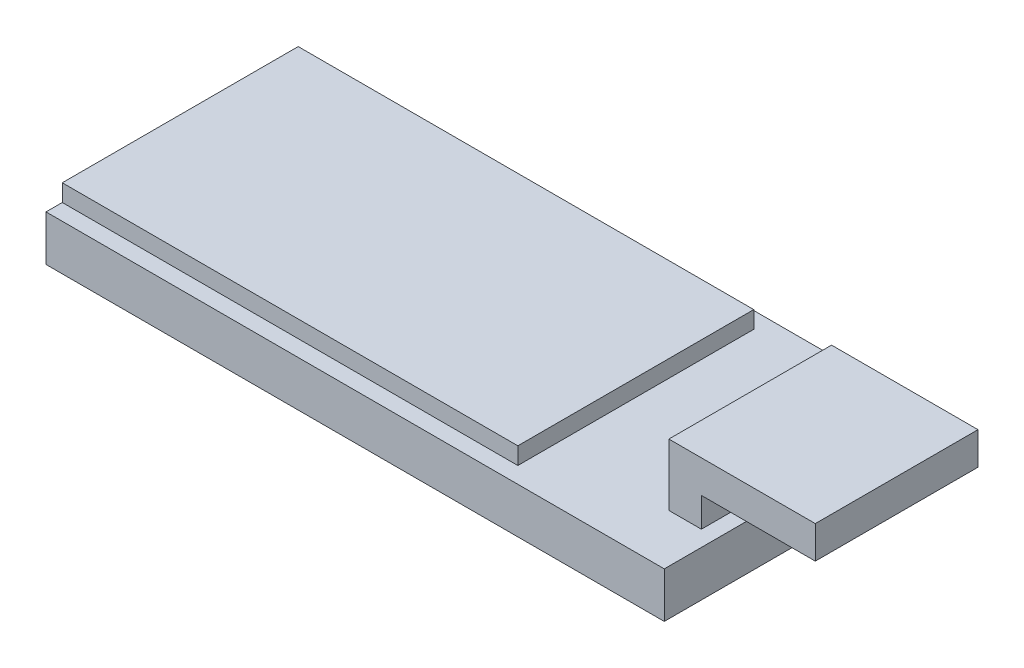
ISO-10303-21;
HEADER;
FILE_DESCRIPTION(('STEP AP214'),'2;1');
FILE_NAME('part.step','',(''),(''),'','','');
FILE_SCHEMA(('AUTOMOTIVE_DESIGN { 1 0 10303 214 1 1 1 1 }'));
ENDSEC;
DATA;
#1=APPLICATION_CONTEXT('core data for automotive mechanical design processes');
#2=APPLICATION_PROTOCOL_DEFINITION('international standard','automotive_design',2000,#1);
#3=PRODUCT_CONTEXT('',#1,'mechanical');
#4=PRODUCT('Part','Part','',(#3));
#5=PRODUCT_RELATED_PRODUCT_CATEGORY('part','',(#4));
#6=PRODUCT_DEFINITION_FORMATION('','',#4);
#7=PRODUCT_DEFINITION_CONTEXT('part definition',#1,'design');
#8=PRODUCT_DEFINITION('design','',#6,#7);
#9=PRODUCT_DEFINITION_SHAPE('','',#8);
#10=(LENGTH_UNIT() NAMED_UNIT(*) SI_UNIT(.MILLI.,.METRE.));
#11=(NAMED_UNIT(*) PLANE_ANGLE_UNIT() SI_UNIT($,.RADIAN.));
#12=(NAMED_UNIT(*) SI_UNIT($,.STERADIAN.) SOLID_ANGLE_UNIT());
#13=UNCERTAINTY_MEASURE_WITH_UNIT(LENGTH_MEASURE(1.E-05),#10,'distance_accuracy_value','');
#14=(GEOMETRIC_REPRESENTATION_CONTEXT(3) GLOBAL_UNCERTAINTY_ASSIGNED_CONTEXT((#13)) GLOBAL_UNIT_ASSIGNED_CONTEXT((#10,
#11,#12)) REPRESENTATION_CONTEXT('',''));
#15=CARTESIAN_POINT('',(0.,0.,0.));
#16=DIRECTION('',(0.,0.,1.));
#17=DIRECTION('',(1.,0.,0.));
#18=AXIS2_PLACEMENT_3D('',#15,#16,#17);
#19=CARTESIAN_POINT('',(0.,-0.4,0.));
#20=DIRECTION('',(0.,1.,0.));
#21=DIRECTION('',(0.,0.,1.));
#22=AXIS2_PLACEMENT_3D('',#19,#20,#21);
#23=PLANE('',#22);
#24=DIRECTION('',(1.,0.,0.));
#25=VECTOR('',#24,1.);
#26=CARTESIAN_POINT('',(0.,-0.4,-8.25));
#27=LINE('',#26,#25);
#28=CARTESIAN_POINT('',(0.,-0.4,-8.25));
#29=VERTEX_POINT('',#28);
#30=CARTESIAN_POINT('',(38.,-0.4,-8.25));
#31=VERTEX_POINT('',#30);
#32=EDGE_CURVE('E243',#29,#31,#27,.T.);
#33=ORIENTED_EDGE('',*,*,#32,.T.);
#34=DIRECTION('',(0.,0.,1.));
#35=VECTOR('',#34,1.);
#36=CARTESIAN_POINT('',(38.,-0.4,0.));
#37=LINE('',#36,#35);
#38=CARTESIAN_POINT('',(38.,-0.4,8.24999999999998));
#39=VERTEX_POINT('',#38);
#40=EDGE_CURVE('E252',#31,#39,#37,.T.);
#41=ORIENTED_EDGE('',*,*,#40,.T.);
#42=DIRECTION('',(1.,0.,0.));
#43=VECTOR('',#42,1.);
#44=CARTESIAN_POINT('',(0.,-0.4,8.25));
#45=LINE('',#44,#43);
#46=CARTESIAN_POINT('',(0.,-0.4,8.25));
#47=VERTEX_POINT('',#46);
#48=EDGE_CURVE('E249',#47,#39,#45,.T.);
#49=ORIENTED_EDGE('',*,*,#48,.F.);
#50=DIRECTION('',(0.,0.,1.));
#51=VECTOR('',#50,1.);
#52=CARTESIAN_POINT('',(0.,-0.4,0.));
#53=LINE('',#52,#51);
#54=EDGE_CURVE('E246',#29,#47,#53,.T.);
#55=ORIENTED_EDGE('',*,*,#54,.F.);
#56=EDGE_LOOP('',(#33,#41,#49,#55));
#57=FACE_BOUND('',#56,.T.);
#58=DIRECTION('',(-1.,0.,0.));
#59=VECTOR('',#58,1.);
#60=CARTESIAN_POINT('',(0.,-0.4,5.));
#61=LINE('',#60,#59);
#62=CARTESIAN_POINT('',(37.0320811107328,-0.4,5.));
#63=VERTEX_POINT('',#62);
#64=CARTESIAN_POINT('',(35.0320811107328,-0.4,5.));
#65=VERTEX_POINT('',#64);
#66=EDGE_CURVE('E192',#63,#65,#61,.T.);
#67=ORIENTED_EDGE('',*,*,#66,.F.);
#68=DIRECTION('',(0.,0.,1.));
#69=VECTOR('',#68,1.);
#70=CARTESIAN_POINT('',(37.0320811107328,-0.4,0.));
#71=LINE('',#70,#69);
#72=CARTESIAN_POINT('',(37.0320811107328,-0.4,-5.));
#73=VERTEX_POINT('',#72);
#74=EDGE_CURVE('E201',#73,#63,#71,.T.);
#75=ORIENTED_EDGE('',*,*,#74,.F.);
#76=DIRECTION('',(-1.,0.,0.));
#77=VECTOR('',#76,1.);
#78=CARTESIAN_POINT('',(0.,-0.4,-5.));
#79=LINE('',#78,#77);
#80=CARTESIAN_POINT('',(35.0320811107328,-0.4,-5.));
#81=VERTEX_POINT('',#80);
#82=EDGE_CURVE('E189',#73,#81,#79,.T.);
#83=ORIENTED_EDGE('',*,*,#82,.T.);
#84=DIRECTION('',(0.,0.,-1.));
#85=VECTOR('',#84,1.);
#86=CARTESIAN_POINT('',(35.0320811107328,-0.4,0.));
#87=LINE('',#86,#85);
#88=EDGE_CURVE('E199',#65,#81,#87,.T.);
#89=ORIENTED_EDGE('',*,*,#88,.F.);
#90=EDGE_LOOP('',(#67,#75,#83,#89));
#91=FACE_BOUND('',#90,.T.);
#92=ADVANCED_FACE('F43',(#57,#91),#23,.F.);
#93=CARTESIAN_POINT('',(0.,2.4,0.));
#94=DIRECTION('',(0.,1.,0.));
#95=DIRECTION('',(0.,0.,1.));
#96=AXIS2_PLACEMENT_3D('',#93,#94,#95);
#97=PLANE('',#96);
#98=DIRECTION('',(-1.,0.,0.));
#99=VECTOR('',#98,1.);
#100=CARTESIAN_POINT('',(0.,2.4,-7.25));
#101=LINE('',#100,#99);
#102=CARTESIAN_POINT('',(28.,2.4,-7.25));
#103=VERTEX_POINT('',#102);
#104=CARTESIAN_POINT('',(0.,2.4,-7.25));
#105=VERTEX_POINT('',#104);
#106=EDGE_CURVE('E203',#103,#105,#101,.T.);
#107=ORIENTED_EDGE('',*,*,#106,.F.);
#108=DIRECTION('',(0.,0.,-1.));
#109=VECTOR('',#108,1.);
#110=CARTESIAN_POINT('',(28.,2.4,0.));
#111=LINE('',#110,#109);
#112=CARTESIAN_POINT('',(28.,2.4,7.25));
#113=VERTEX_POINT('',#112);
#114=EDGE_CURVE('E218',#113,#103,#111,.T.);
#115=ORIENTED_EDGE('',*,*,#114,.F.);
#116=DIRECTION('',(-1.,0.,0.));
#117=VECTOR('',#116,1.);
#118=CARTESIAN_POINT('',(0.,2.4,7.25));
#119=LINE('',#118,#117);
#120=CARTESIAN_POINT('',(0.,2.4,7.25));
#121=VERTEX_POINT('',#120);
#122=EDGE_CURVE('E208',#113,#121,#119,.T.);
#123=ORIENTED_EDGE('',*,*,#122,.T.);
#124=DIRECTION('',(0.,0.,1.));
#125=VECTOR('',#124,1.);
#126=CARTESIAN_POINT('',(0.,2.4,0.));
#127=LINE('',#126,#125);
#128=CARTESIAN_POINT('',(0.,2.4,8.25));
#129=VERTEX_POINT('',#128);
#130=EDGE_CURVE('E233',#121,#129,#127,.T.);
#131=ORIENTED_EDGE('',*,*,#130,.T.);
#132=DIRECTION('',(1.,0.,0.));
#133=VECTOR('',#132,1.);
#134=CARTESIAN_POINT('',(0.,2.4,8.25));
#135=LINE('',#134,#133);
#136=CARTESIAN_POINT('',(38.,2.4,8.24999999999998));
#137=VERTEX_POINT('',#136);
#138=EDGE_CURVE('E237',#129,#137,#135,.T.);
#139=ORIENTED_EDGE('',*,*,#138,.T.);
#140=DIRECTION('',(0.,0.,1.));
#141=VECTOR('',#140,1.);
#142=CARTESIAN_POINT('',(38.,2.4,0.));
#143=LINE('',#142,#141);
#144=CARTESIAN_POINT('',(38.,2.4,-8.25));
#145=VERTEX_POINT('',#144);
#146=EDGE_CURVE('E240',#145,#137,#143,.T.);
#147=ORIENTED_EDGE('',*,*,#146,.F.);
#148=DIRECTION('',(1.,0.,0.));
#149=VECTOR('',#148,1.);
#150=CARTESIAN_POINT('',(0.,2.4,-8.25));
#151=LINE('',#150,#149);
#152=CARTESIAN_POINT('',(0.,2.4,-8.25));
#153=VERTEX_POINT('',#152);
#154=EDGE_CURVE('E224',#153,#145,#151,.T.);
#155=ORIENTED_EDGE('',*,*,#154,.F.);
#156=EDGE_CURVE('E234',#153,#105,#127,.T.);
#157=ORIENTED_EDGE('',*,*,#156,.T.);
#158=EDGE_LOOP('',(#107,#115,#123,#131,#139,#147,#155,#157));
#159=FACE_BOUND('',#158,.T.);
#160=DIRECTION('',(0.,0.,1.));
#161=VECTOR('',#160,1.);
#162=CARTESIAN_POINT('',(37.0320811107328,2.4,0.));
#163=LINE('',#162,#161);
#164=CARTESIAN_POINT('',(37.0320811107328,2.4,-5.));
#165=VERTEX_POINT('',#164);
#166=CARTESIAN_POINT('',(37.0320811107328,2.4,5.));
#167=VERTEX_POINT('',#166);
#168=EDGE_CURVE('E51',#165,#167,#163,.T.);
#169=ORIENTED_EDGE('',*,*,#168,.T.);
#170=DIRECTION('',(-1.,0.,0.));
#171=VECTOR('',#170,1.);
#172=CARTESIAN_POINT('',(0.,2.4,5.));
#173=LINE('',#172,#171);
#174=CARTESIAN_POINT('',(35.0320811107328,2.4,5.));
#175=VERTEX_POINT('',#174);
#176=EDGE_CURVE('E11',#167,#175,#173,.T.);
#177=ORIENTED_EDGE('',*,*,#176,.T.);
#178=DIRECTION('',(0.,0.,-1.));
#179=VECTOR('',#178,1.);
#180=CARTESIAN_POINT('',(35.0320811107328,2.4,0.));
#181=LINE('',#180,#179);
#182=CARTESIAN_POINT('',(35.0320811107328,2.4,-5.));
#183=VERTEX_POINT('',#182);
#184=EDGE_CURVE('E266',#175,#183,#181,.T.);
#185=ORIENTED_EDGE('',*,*,#184,.T.);
#186=DIRECTION('',(-1.,0.,0.));
#187=VECTOR('',#186,1.);
#188=CARTESIAN_POINT('',(0.,2.4,-5.));
#189=LINE('',#188,#187);
#190=EDGE_CURVE('E257',#165,#183,#189,.T.);
#191=ORIENTED_EDGE('',*,*,#190,.F.);
#192=EDGE_LOOP('',(#169,#177,#185,#191));
#193=FACE_BOUND('',#192,.T.);
#194=ADVANCED_FACE('F268',(#159,#193),#97,.T.);
#195=CARTESIAN_POINT('',(0.,-0.4,-8.25));
#196=DIRECTION('',(0.,0.,1.));
#197=DIRECTION('',(1.,0.,0.));
#198=AXIS2_PLACEMENT_3D('',#195,#196,#197);
#199=PLANE('',#198);
#200=DIRECTION('',(0.,1.,0.));
#201=VECTOR('',#200,1.);
#202=CARTESIAN_POINT('',(0.,-0.4,-8.25));
#203=LINE('',#202,#201);
#204=EDGE_CURVE('E254',#29,#153,#203,.T.);
#205=ORIENTED_EDGE('',*,*,#204,.T.);
#206=ORIENTED_EDGE('',*,*,#154,.T.);
#207=DIRECTION('',(0.,1.,0.));
#208=VECTOR('',#207,1.);
#209=CARTESIAN_POINT('',(38.,-0.4,-8.25));
#210=LINE('',#209,#208);
#211=EDGE_CURVE('E255',#31,#145,#210,.T.);
#212=ORIENTED_EDGE('',*,*,#211,.F.);
#213=ORIENTED_EDGE('',*,*,#32,.F.);
#214=EDGE_LOOP('',(#205,#206,#212,#213));
#215=FACE_BOUND('',#214,.T.);
#216=ADVANCED_FACE('F45',(#215),#199,.F.);
#217=CARTESIAN_POINT('',(38.,-0.4,0.));
#218=DIRECTION('',(-1.,0.,0.));
#219=DIRECTION('',(0.,0.,1.));
#220=AXIS2_PLACEMENT_3D('',#217,#218,#219);
#221=PLANE('',#220);
#222=ORIENTED_EDGE('',*,*,#211,.T.);
#223=ORIENTED_EDGE('',*,*,#146,.T.);
#224=DIRECTION('',(0.,1.,0.));
#225=VECTOR('',#224,1.);
#226=CARTESIAN_POINT('',(38.,-0.4,8.24999999999998));
#227=LINE('',#226,#225);
#228=EDGE_CURVE('E258',#39,#137,#227,.T.);
#229=ORIENTED_EDGE('',*,*,#228,.F.);
#230=ORIENTED_EDGE('',*,*,#40,.F.);
#231=EDGE_LOOP('',(#222,#223,#229,#230));
#232=FACE_BOUND('',#231,.T.);
#233=ADVANCED_FACE('F353',(#232),#221,.F.);
#234=CARTESIAN_POINT('',(0.,-0.4,8.25));
#235=DIRECTION('',(0.,0.,1.));
#236=DIRECTION('',(1.,0.,0.));
#237=AXIS2_PLACEMENT_3D('',#234,#235,#236);
#238=PLANE('',#237);
#239=ORIENTED_EDGE('',*,*,#228,.T.);
#240=ORIENTED_EDGE('',*,*,#138,.F.);
#241=DIRECTION('',(0.,1.,0.));
#242=VECTOR('',#241,1.);
#243=CARTESIAN_POINT('',(0.,-0.4,8.25));
#244=LINE('',#243,#242);
#245=EDGE_CURVE('E260',#47,#129,#244,.T.);
#246=ORIENTED_EDGE('',*,*,#245,.F.);
#247=ORIENTED_EDGE('',*,*,#48,.T.);
#248=EDGE_LOOP('',(#239,#240,#246,#247));
#249=FACE_BOUND('',#248,.T.);
#250=ADVANCED_FACE('F356',(#249),#238,.T.);
#251=CARTESIAN_POINT('',(0.,-0.4,0.));
#252=DIRECTION('',(-1.,0.,0.));
#253=DIRECTION('',(0.,0.,1.));
#254=AXIS2_PLACEMENT_3D('',#251,#252,#253);
#255=PLANE('',#254);
#256=ORIENTED_EDGE('',*,*,#245,.T.);
#257=ORIENTED_EDGE('',*,*,#130,.F.);
#258=DIRECTION('',(0.,-1.,0.));
#259=VECTOR('',#258,1.);
#260=CARTESIAN_POINT('',(0.,3.45,7.25));
#261=LINE('',#260,#259);
#262=CARTESIAN_POINT('',(0.,3.45,7.25));
#263=VERTEX_POINT('',#262);
#264=EDGE_CURVE('E222',#263,#121,#261,.T.);
#265=ORIENTED_EDGE('',*,*,#264,.F.);
#266=DIRECTION('',(0.,0.,-1.));
#267=VECTOR('',#266,1.);
#268=CARTESIAN_POINT('',(0.,3.45,0.));
#269=LINE('',#268,#267);
#270=CARTESIAN_POINT('',(0.,3.45,-7.25));
#271=VERTEX_POINT('',#270);
#272=EDGE_CURVE('E204',#263,#271,#269,.T.);
#273=ORIENTED_EDGE('',*,*,#272,.T.);
#274=DIRECTION('',(0.,-1.,0.));
#275=VECTOR('',#274,1.);
#276=CARTESIAN_POINT('',(0.,3.45,-7.25));
#277=LINE('',#276,#275);
#278=EDGE_CURVE('E215',#271,#105,#277,.T.);
#279=ORIENTED_EDGE('',*,*,#278,.T.);
#280=ORIENTED_EDGE('',*,*,#156,.F.);
#281=ORIENTED_EDGE('',*,*,#204,.F.);
#282=ORIENTED_EDGE('',*,*,#54,.T.);
#283=EDGE_LOOP('',(#256,#257,#265,#273,#279,#280,#281,#282));
#284=FACE_BOUND('',#283,.T.);
#285=ADVANCED_FACE('F359',(#284),#255,.T.);
#286=CARTESIAN_POINT('',(0.,3.45,7.25));
#287=DIRECTION('',(0.,0.,1.));
#288=DIRECTION('',(1.,0.,0.));
#289=AXIS2_PLACEMENT_3D('',#286,#287,#288);
#290=PLANE('',#289);
#291=ORIENTED_EDGE('',*,*,#122,.F.);
#292=DIRECTION('',(0.,-1.,0.));
#293=VECTOR('',#292,1.);
#294=CARTESIAN_POINT('',(28.,3.45,7.25));
#295=LINE('',#294,#293);
#296=CARTESIAN_POINT('',(28.,3.45,7.25));
#297=VERTEX_POINT('',#296);
#298=EDGE_CURVE('E225',#297,#113,#295,.T.);
#299=ORIENTED_EDGE('',*,*,#298,.F.);
#300=DIRECTION('',(-1.,0.,0.));
#301=VECTOR('',#300,1.);
#302=CARTESIAN_POINT('',(0.,3.45,7.25));
#303=LINE('',#302,#301);
#304=EDGE_CURVE('E212',#297,#263,#303,.T.);
#305=ORIENTED_EDGE('',*,*,#304,.T.);
#306=ORIENTED_EDGE('',*,*,#264,.T.);
#307=EDGE_LOOP('',(#291,#299,#305,#306));
#308=FACE_BOUND('',#307,.T.);
#309=ADVANCED_FACE('F362',(#308),#290,.T.);
#310=CARTESIAN_POINT('',(28.,3.45,0.));
#311=DIRECTION('',(-1.,0.,0.));
#312=DIRECTION('',(0.,0.,1.));
#313=AXIS2_PLACEMENT_3D('',#310,#311,#312);
#314=PLANE('',#313);
#315=ORIENTED_EDGE('',*,*,#114,.T.);
#316=DIRECTION('',(0.,-1.,0.));
#317=VECTOR('',#316,1.);
#318=CARTESIAN_POINT('',(28.,3.45,-7.25));
#319=LINE('',#318,#317);
#320=CARTESIAN_POINT('',(28.,3.45,-7.25));
#321=VERTEX_POINT('',#320);
#322=EDGE_CURVE('E227',#321,#103,#319,.T.);
#323=ORIENTED_EDGE('',*,*,#322,.F.);
#324=DIRECTION('',(0.,0.,-1.));
#325=VECTOR('',#324,1.);
#326=CARTESIAN_POINT('',(28.,3.45,0.));
#327=LINE('',#326,#325);
#328=EDGE_CURVE('E210',#297,#321,#327,.T.);
#329=ORIENTED_EDGE('',*,*,#328,.F.);
#330=ORIENTED_EDGE('',*,*,#298,.T.);
#331=EDGE_LOOP('',(#315,#323,#329,#330));
#332=FACE_BOUND('',#331,.T.);
#333=ADVANCED_FACE('F367',(#332),#314,.F.);
#334=CARTESIAN_POINT('',(0.,3.45,-7.25));
#335=DIRECTION('',(0.,0.,1.));
#336=DIRECTION('',(1.,0.,0.));
#337=AXIS2_PLACEMENT_3D('',#334,#335,#336);
#338=PLANE('',#337);
#339=ORIENTED_EDGE('',*,*,#106,.T.);
#340=ORIENTED_EDGE('',*,*,#278,.F.);
#341=DIRECTION('',(-1.,0.,0.));
#342=VECTOR('',#341,1.);
#343=CARTESIAN_POINT('',(0.,3.45,-7.25));
#344=LINE('',#343,#342);
#345=EDGE_CURVE('E207',#321,#271,#344,.T.);
#346=ORIENTED_EDGE('',*,*,#345,.F.);
#347=ORIENTED_EDGE('',*,*,#322,.T.);
#348=EDGE_LOOP('',(#339,#340,#346,#347));
#349=FACE_BOUND('',#348,.T.);
#350=ADVANCED_FACE('F387',(#349),#338,.F.);
#351=CARTESIAN_POINT('',(0.,3.45,0.));
#352=DIRECTION('',(0.,1.,0.));
#353=DIRECTION('',(0.,0.,1.));
#354=AXIS2_PLACEMENT_3D('',#351,#352,#353);
#355=PLANE('',#354);
#356=ORIENTED_EDGE('',*,*,#272,.F.);
#357=ORIENTED_EDGE('',*,*,#304,.F.);
#358=ORIENTED_EDGE('',*,*,#328,.T.);
#359=ORIENTED_EDGE('',*,*,#345,.T.);
#360=EDGE_LOOP('',(#356,#357,#358,#359));
#361=FACE_BOUND('',#360,.T.);
#362=ADVANCED_FACE('F394',(#361),#355,.T.);
#363=CARTESIAN_POINT('',(44.0320811107328,4.20000000000001,5.));
#364=DIRECTION('',(0.,1.,0.));
#365=DIRECTION('',(-1.,0.,0.));
#366=AXIS2_PLACEMENT_3D('',#363,#364,#365);
#367=PLANE('',#366);
#368=DIRECTION('',(1.,0.,0.));
#369=VECTOR('',#368,1.);
#370=CARTESIAN_POINT('',(44.0320811107328,4.20000000000001,-5.));
#371=LINE('',#370,#369);
#372=CARTESIAN_POINT('',(37.0320811107328,4.2,-5.));
#373=VERTEX_POINT('',#372);
#374=CARTESIAN_POINT('',(44.0320811107328,4.20000000000001,-5.));
#375=VERTEX_POINT('',#374);
#376=EDGE_CURVE('E303',#373,#375,#371,.T.);
#377=ORIENTED_EDGE('',*,*,#376,.T.);
#378=DIRECTION('',(0.,0.,-1.));
#379=VECTOR('',#378,1.);
#380=CARTESIAN_POINT('',(44.0320811107328,4.20000000000001,5.));
#381=LINE('',#380,#379);
#382=CARTESIAN_POINT('',(44.0320811107328,4.20000000000001,5.));
#383=VERTEX_POINT('',#382);
#384=EDGE_CURVE('E181',#383,#375,#381,.T.);
#385=ORIENTED_EDGE('',*,*,#384,.F.);
#386=DIRECTION('',(1.,0.,0.));
#387=VECTOR('',#386,1.);
#388=CARTESIAN_POINT('',(44.0320811107328,4.20000000000001,5.));
#389=LINE('',#388,#387);
#390=CARTESIAN_POINT('',(37.0320811107328,4.2,5.));
#391=VERTEX_POINT('',#390);
#392=EDGE_CURVE('E168',#391,#383,#389,.T.);
#393=ORIENTED_EDGE('',*,*,#392,.F.);
#394=DIRECTION('',(0.,0.,-1.));
#395=VECTOR('',#394,1.);
#396=CARTESIAN_POINT('',(37.0320811107328,4.2,5.));
#397=LINE('',#396,#395);
#398=EDGE_CURVE('E179',#391,#373,#397,.T.);
#399=ORIENTED_EDGE('',*,*,#398,.T.);
#400=EDGE_LOOP('',(#377,#385,#393,#399));
#401=FACE_BOUND('',#400,.T.);
#402=ADVANCED_FACE('F178',(#401),#367,.F.);
#403=CARTESIAN_POINT('',(44.0320811107328,6.20000000000001,5.));
#404=DIRECTION('',(-1.,0.,0.));
#405=DIRECTION('',(0.,0.,1.));
#406=AXIS2_PLACEMENT_3D('',#403,#404,#405);
#407=PLANE('',#406);
#408=DIRECTION('',(0.,1.,0.));
#409=VECTOR('',#408,1.);
#410=CARTESIAN_POINT('',(44.0320811107328,6.20000000000001,-5.));
#411=LINE('',#410,#409);
#412=CARTESIAN_POINT('',(44.0320811107328,6.20000000000001,-5.));
#413=VERTEX_POINT('',#412);
#414=EDGE_CURVE('E302',#375,#413,#411,.T.);
#415=ORIENTED_EDGE('',*,*,#414,.T.);
#416=DIRECTION('',(0.,0.,-1.));
#417=VECTOR('',#416,1.);
#418=CARTESIAN_POINT('',(44.0320811107328,6.20000000000001,5.));
#419=LINE('',#418,#417);
#420=CARTESIAN_POINT('',(44.0320811107328,6.20000000000001,5.));
#421=VERTEX_POINT('',#420);
#422=EDGE_CURVE('E194',#421,#413,#419,.T.);
#423=ORIENTED_EDGE('',*,*,#422,.F.);
#424=DIRECTION('',(0.,1.,0.));
#425=VECTOR('',#424,1.);
#426=CARTESIAN_POINT('',(44.0320811107328,6.20000000000001,5.));
#427=LINE('',#426,#425);
#428=EDGE_CURVE('E183',#383,#421,#427,.T.);
#429=ORIENTED_EDGE('',*,*,#428,.F.);
#430=ORIENTED_EDGE('',*,*,#384,.T.);
#431=EDGE_LOOP('',(#415,#423,#429,#430));
#432=FACE_BOUND('',#431,.T.);
#433=ADVANCED_FACE('F401',(#432),#407,.F.);
#434=CARTESIAN_POINT('',(35.0320811107328,6.20000000000001,5.));
#435=DIRECTION('',(0.,-1.,0.));
#436=DIRECTION('',(0.,0.,-1.));
#437=AXIS2_PLACEMENT_3D('',#434,#435,#436);
#438=PLANE('',#437);
#439=DIRECTION('',(-1.,0.,0.));
#440=VECTOR('',#439,1.);
#441=CARTESIAN_POINT('',(35.0320811107328,6.20000000000001,-5.));
#442=LINE('',#441,#440);
#443=CARTESIAN_POINT('',(35.0320811107328,6.20000000000001,-5.));
#444=VERTEX_POINT('',#443);
#445=EDGE_CURVE('E283',#413,#444,#442,.T.);
#446=ORIENTED_EDGE('',*,*,#445,.T.);
#447=DIRECTION('',(0.,0.,-1.));
#448=VECTOR('',#447,1.);
#449=CARTESIAN_POINT('',(35.0320811107328,6.20000000000001,5.));
#450=LINE('',#449,#448);
#451=CARTESIAN_POINT('',(35.0320811107328,6.20000000000001,5.));
#452=VERTEX_POINT('',#451);
#453=EDGE_CURVE('E280',#452,#444,#450,.T.);
#454=ORIENTED_EDGE('',*,*,#453,.F.);
#455=DIRECTION('',(-1.,0.,0.));
#456=VECTOR('',#455,1.);
#457=CARTESIAN_POINT('',(35.0320811107328,6.20000000000001,5.));
#458=LINE('',#457,#456);
#459=EDGE_CURVE('E299',#421,#452,#458,.T.);
#460=ORIENTED_EDGE('',*,*,#459,.F.);
#461=ORIENTED_EDGE('',*,*,#422,.T.);
#462=EDGE_LOOP('',(#446,#454,#460,#461));
#463=FACE_BOUND('',#462,.T.);
#464=ADVANCED_FACE('F298',(#463),#438,.F.);
#465=CARTESIAN_POINT('',(0.,0.,-5.));
#466=DIRECTION('',(0.,0.,-1.));
#467=DIRECTION('',(-1.,0.,0.));
#468=AXIS2_PLACEMENT_3D('',#465,#466,#467);
#469=PLANE('',#468);
#470=DIRECTION('',(0.,1.,0.));
#471=VECTOR('',#470,1.);
#472=CARTESIAN_POINT('',(37.0320811107328,4.2,-5.));
#473=LINE('',#472,#471);
#474=EDGE_CURVE('E187',#165,#373,#473,.T.);
#475=ORIENTED_EDGE('',*,*,#474,.F.);
#476=ORIENTED_EDGE('',*,*,#190,.T.);
#477=DIRECTION('',(0.,-1.,0.));
#478=VECTOR('',#477,1.);
#479=CARTESIAN_POINT('',(35.0320811107328,-0.999999999999996,-5.));
#480=LINE('',#479,#478);
#481=EDGE_CURVE('E276',#444,#183,#480,.T.);
#482=ORIENTED_EDGE('',*,*,#481,.F.);
#483=ORIENTED_EDGE('',*,*,#445,.F.);
#484=ORIENTED_EDGE('',*,*,#414,.F.);
#485=ORIENTED_EDGE('',*,*,#376,.F.);
#486=EDGE_LOOP('',(#475,#476,#482,#483,#484,#485));
#487=FACE_BOUND('',#486,.T.);
#488=ADVANCED_FACE('F274',(#487),#469,.T.);
#489=CARTESIAN_POINT('',(0.,0.,5.));
#490=DIRECTION('',(0.,0.,-1.));
#491=DIRECTION('',(-1.,0.,0.));
#492=AXIS2_PLACEMENT_3D('',#489,#490,#491);
#493=PLANE('',#492);
#494=ORIENTED_EDGE('',*,*,#176,.F.);
#495=DIRECTION('',(0.,1.,0.));
#496=VECTOR('',#495,1.);
#497=CARTESIAN_POINT('',(37.0320811107328,4.2,5.));
#498=LINE('',#497,#496);
#499=EDGE_CURVE('E165',#167,#391,#498,.T.);
#500=ORIENTED_EDGE('',*,*,#499,.T.);
#501=ORIENTED_EDGE('',*,*,#392,.T.);
#502=ORIENTED_EDGE('',*,*,#428,.T.);
#503=ORIENTED_EDGE('',*,*,#459,.T.);
#504=DIRECTION('',(0.,-1.,0.));
#505=VECTOR('',#504,1.);
#506=CARTESIAN_POINT('',(35.0320811107328,-0.999999999999996,5.));
#507=LINE('',#506,#505);
#508=EDGE_CURVE('E310',#452,#175,#507,.T.);
#509=ORIENTED_EDGE('',*,*,#508,.T.);
#510=EDGE_LOOP('',(#494,#500,#501,#502,#503,#509));
#511=FACE_BOUND('',#510,.T.);
#512=ADVANCED_FACE('F167',(#511),#493,.F.);
#513=CARTESIAN_POINT('',(35.0320811107328,-0.999999999999996,5.));
#514=DIRECTION('',(1.,0.,0.));
#515=DIRECTION('',(0.,0.,-1.));
#516=AXIS2_PLACEMENT_3D('',#513,#514,#515);
#517=PLANE('',#516);
#518=ORIENTED_EDGE('',*,*,#184,.F.);
#519=ORIENTED_EDGE('',*,*,#508,.F.);
#520=ORIENTED_EDGE('',*,*,#453,.T.);
#521=ORIENTED_EDGE('',*,*,#481,.T.);
#522=EDGE_LOOP('',(#518,#519,#520,#521));
#523=FACE_BOUND('',#522,.T.);
#524=ADVANCED_FACE('F278',(#523),#517,.F.);
#525=CARTESIAN_POINT('',(37.0320811107328,4.2,5.));
#526=DIRECTION('',(-1.,0.,0.));
#527=DIRECTION('',(0.,0.,1.));
#528=AXIS2_PLACEMENT_3D('',#525,#526,#527);
#529=PLANE('',#528);
#530=ORIENTED_EDGE('',*,*,#168,.F.);
#531=ORIENTED_EDGE('',*,*,#474,.T.);
#532=ORIENTED_EDGE('',*,*,#398,.F.);
#533=ORIENTED_EDGE('',*,*,#499,.F.);
#534=EDGE_LOOP('',(#530,#531,#532,#533));
#535=FACE_BOUND('',#534,.T.);
#536=ADVANCED_FACE('F185',(#535),#529,.F.);
#537=CARTESIAN_POINT('',(37.0320811107328,-0.999999999999995,-5.));
#538=VERTEX_POINT('',#537);
#539=EDGE_CURVE('E304',#538,#73,#473,.T.);
#540=ORIENTED_EDGE('',*,*,#539,.T.);
#541=ORIENTED_EDGE('',*,*,#74,.T.);
#542=CARTESIAN_POINT('',(37.0320811107328,-0.999999999999995,5.));
#543=VERTEX_POINT('',#542);
#544=EDGE_CURVE('E173',#543,#63,#498,.T.);
#545=ORIENTED_EDGE('',*,*,#544,.F.);
#546=DIRECTION('',(0.,0.,-1.));
#547=VECTOR('',#546,1.);
#548=CARTESIAN_POINT('',(37.0320811107328,-0.999999999999995,5.));
#549=LINE('',#548,#547);
#550=EDGE_CURVE('E287',#543,#538,#549,.T.);
#551=ORIENTED_EDGE('',*,*,#550,.T.);
#552=EDGE_LOOP('',(#540,#541,#545,#551));
#553=FACE_BOUND('',#552,.T.);
#554=ADVANCED_FACE('F332',(#553),#529,.F.);
#555=CARTESIAN_POINT('',(35.0320811107328,-0.999999999999996,5.));
#556=VERTEX_POINT('',#555);
#557=EDGE_CURVE('E312',#65,#556,#507,.T.);
#558=ORIENTED_EDGE('',*,*,#557,.F.);
#559=ORIENTED_EDGE('',*,*,#88,.T.);
#560=CARTESIAN_POINT('',(35.0320811107328,-0.999999999999996,-5.));
#561=VERTEX_POINT('',#560);
#562=EDGE_CURVE('E58',#81,#561,#480,.T.);
#563=ORIENTED_EDGE('',*,*,#562,.T.);
#564=DIRECTION('',(0.,0.,-1.));
#565=VECTOR('',#564,1.);
#566=CARTESIAN_POINT('',(35.0320811107328,-0.999999999999996,5.));
#567=LINE('',#566,#565);
#568=EDGE_CURVE('E290',#556,#561,#567,.T.);
#569=ORIENTED_EDGE('',*,*,#568,.F.);
#570=EDGE_LOOP('',(#558,#559,#563,#569));
#571=FACE_BOUND('',#570,.T.);
#572=ADVANCED_FACE('F327',(#571),#517,.F.);
#573=ORIENTED_EDGE('',*,*,#544,.T.);
#574=ORIENTED_EDGE('',*,*,#66,.T.);
#575=ORIENTED_EDGE('',*,*,#557,.T.);
#576=DIRECTION('',(1.,0.,0.));
#577=VECTOR('',#576,1.);
#578=CARTESIAN_POINT('',(37.0320811107328,-0.999999999999995,5.));
#579=LINE('',#578,#577);
#580=EDGE_CURVE('E291',#556,#543,#579,.T.);
#581=ORIENTED_EDGE('',*,*,#580,.T.);
#582=EDGE_LOOP('',(#573,#574,#575,#581));
#583=FACE_BOUND('',#582,.T.);
#584=ADVANCED_FACE('F318',(#583),#493,.F.);
#585=ORIENTED_EDGE('',*,*,#82,.F.);
#586=ORIENTED_EDGE('',*,*,#539,.F.);
#587=DIRECTION('',(1.,0.,0.));
#588=VECTOR('',#587,1.);
#589=CARTESIAN_POINT('',(37.0320811107328,-0.999999999999995,-5.));
#590=LINE('',#589,#588);
#591=EDGE_CURVE('E174',#561,#538,#590,.T.);
#592=ORIENTED_EDGE('',*,*,#591,.F.);
#593=ORIENTED_EDGE('',*,*,#562,.F.);
#594=EDGE_LOOP('',(#585,#586,#592,#593));
#595=FACE_BOUND('',#594,.T.);
#596=ADVANCED_FACE('F333',(#595),#469,.T.);
#597=CARTESIAN_POINT('',(37.0320811107328,-0.999999999999995,5.));
#598=DIRECTION('',(0.,1.,0.));
#599=DIRECTION('',(-1.,0.,0.));
#600=AXIS2_PLACEMENT_3D('',#597,#598,#599);
#601=PLANE('',#600);
#602=ORIENTED_EDGE('',*,*,#591,.T.);
#603=ORIENTED_EDGE('',*,*,#550,.F.);
#604=ORIENTED_EDGE('',*,*,#580,.F.);
#605=ORIENTED_EDGE('',*,*,#568,.T.);
#606=EDGE_LOOP('',(#602,#603,#604,#605));
#607=FACE_BOUND('',#606,.T.);
#608=ADVANCED_FACE('F330',(#607),#601,.F.);
#609=CLOSED_SHELL('',(#92,#194,#216,#233,#250,#285,#309,#333,#350,#362,#402,#433,#464,#488,#512,
#524,#536,#554,#572,#584,#596,#608));
#610=MANIFOLD_SOLID_BREP('B2',#609);
#611=ADVANCED_BREP_SHAPE_REPRESENTATION('',(#18,#610),#14);
#612=SHAPE_DEFINITION_REPRESENTATION(#9,#611);
ENDSEC;
END-ISO-10303-21;
